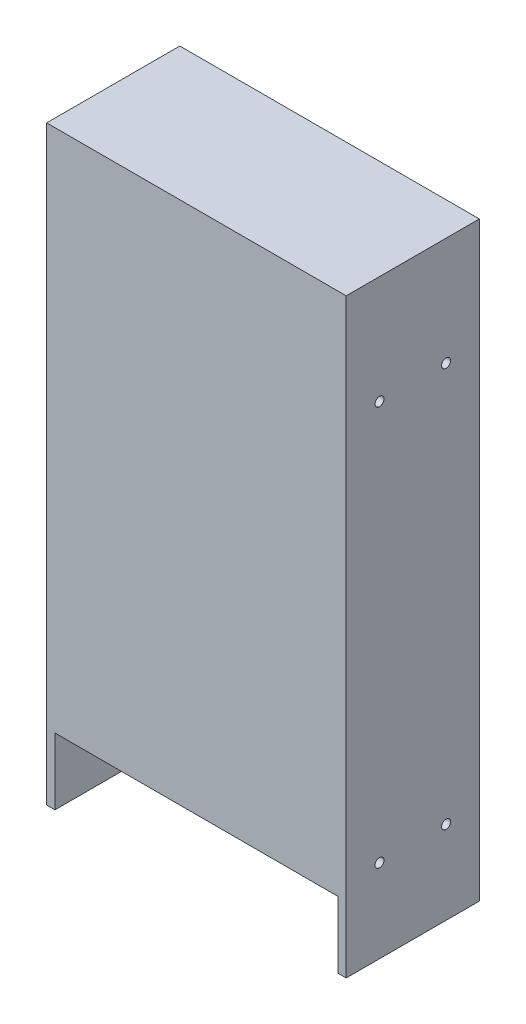
ISO-10303-21;
HEADER;
FILE_DESCRIPTION(('STEP AP214'),'2;1');
FILE_NAME('part.step','',(''),(''),'','','');
FILE_SCHEMA(('AUTOMOTIVE_DESIGN { 1 0 10303 214 1 1 1 1 }'));
ENDSEC;
DATA;
#1=APPLICATION_CONTEXT('core data for automotive mechanical design processes');
#2=APPLICATION_PROTOCOL_DEFINITION('international standard','automotive_design',2000,#1);
#3=PRODUCT_CONTEXT('',#1,'mechanical');
#4=PRODUCT('Part','Part','',(#3));
#5=PRODUCT_RELATED_PRODUCT_CATEGORY('part','',(#4));
#6=PRODUCT_DEFINITION_FORMATION('','',#4);
#7=PRODUCT_DEFINITION_CONTEXT('part definition',#1,'design');
#8=PRODUCT_DEFINITION('design','',#6,#7);
#9=PRODUCT_DEFINITION_SHAPE('','',#8);
#10=(LENGTH_UNIT() NAMED_UNIT(*) SI_UNIT(.MILLI.,.METRE.));
#11=(NAMED_UNIT(*) PLANE_ANGLE_UNIT() SI_UNIT($,.RADIAN.));
#12=(NAMED_UNIT(*) SI_UNIT($,.STERADIAN.) SOLID_ANGLE_UNIT());
#13=UNCERTAINTY_MEASURE_WITH_UNIT(LENGTH_MEASURE(1.E-05),#10,'distance_accuracy_value','');
#14=(GEOMETRIC_REPRESENTATION_CONTEXT(3) GLOBAL_UNCERTAINTY_ASSIGNED_CONTEXT((#13)) GLOBAL_UNIT_ASSIGNED_CONTEXT((#10,
#11,#12)) REPRESENTATION_CONTEXT('',''));
#15=CARTESIAN_POINT('',(0.,0.,0.));
#16=DIRECTION('',(0.,0.,1.));
#17=DIRECTION('',(1.,0.,0.));
#18=AXIS2_PLACEMENT_3D('',#15,#16,#17);
#19=CARTESIAN_POINT('',(-53.6165322580645,41.1725806451613,50.8));
#20=DIRECTION('',(1.,0.,0.));
#21=DIRECTION('',(0.,1.,0.));
#22=AXIS2_PLACEMENT_3D('',#19,#20,#21);
#23=PLANE('',#22);
#24=CARTESIAN_POINT('',(-53.6165322580645,-0.102419354838687,12.7000000000005));
#25=DIRECTION('',(1.,0.,0.));
#26=DIRECTION('',(0.,1.,0.));
#27=AXIS2_PLACEMENT_3D('',#24,#25,#26);
#28=CIRCLE('',#27,1.7145);
#29=CARTESIAN_POINT('',(-53.6165322580645,1.61208064516131,12.7000000000005));
#30=VERTEX_POINT('',#29);
#31=EDGE_CURVE('E198',#30,#30,#28,.F.);
#32=ORIENTED_EDGE('',*,*,#31,.F.);
#33=EDGE_LOOP('',(#32));
#34=FACE_BOUND('',#33,.T.);
#35=CARTESIAN_POINT('',(-53.6165322580645,-0.102419354838853,38.1000000000005));
#36=DIRECTION('',(1.,0.,0.));
#37=DIRECTION('',(0.,1.,0.));
#38=AXIS2_PLACEMENT_3D('',#35,#36,#37);
#39=CIRCLE('',#38,1.7145);
#40=CARTESIAN_POINT('',(-53.6165322580645,1.61208064516114,38.1000000000005));
#41=VERTEX_POINT('',#40);
#42=EDGE_CURVE('E202',#41,#41,#39,.F.);
#43=ORIENTED_EDGE('',*,*,#42,.F.);
#44=EDGE_LOOP('',(#43));
#45=FACE_BOUND('',#44,.T.);
#46=CARTESIAN_POINT('',(-53.6165322580645,-152.502419354839,38.1));
#47=DIRECTION('',(1.,0.,0.));
#48=DIRECTION('',(0.,1.,0.));
#49=AXIS2_PLACEMENT_3D('',#46,#47,#48);
#50=CIRCLE('',#49,1.7145);
#51=CARTESIAN_POINT('',(-53.6165322580645,-150.787919354839,38.1));
#52=VERTEX_POINT('',#51);
#53=EDGE_CURVE('E206',#52,#52,#50,.F.);
#54=ORIENTED_EDGE('',*,*,#53,.F.);
#55=EDGE_LOOP('',(#54));
#56=FACE_BOUND('',#55,.T.);
#57=CARTESIAN_POINT('',(-53.6165322580645,-152.502419354839,12.7));
#58=DIRECTION('',(1.,0.,0.));
#59=DIRECTION('',(0.,1.,0.));
#60=AXIS2_PLACEMENT_3D('',#57,#58,#59);
#61=CIRCLE('',#60,1.7145);
#62=CARTESIAN_POINT('',(-53.6165322580645,-150.787919354839,12.7));
#63=VERTEX_POINT('',#62);
#64=EDGE_CURVE('E138',#63,#63,#61,.F.);
#65=ORIENTED_EDGE('',*,*,#64,.F.);
#66=EDGE_LOOP('',(#65));
#67=FACE_BOUND('',#66,.T.);
#68=DIRECTION('',(0.,-1.,0.));
#69=VECTOR('',#68,1.);
#70=CARTESIAN_POINT('',(-53.6165322580645,41.1725806451613,0.));
#71=LINE('',#70,#69);
#72=CARTESIAN_POINT('',(-53.6165322580645,41.1725806451613,0.));
#73=VERTEX_POINT('',#72);
#74=CARTESIAN_POINT('',(-53.6165322580645,-184.252419354839,0.));
#75=VERTEX_POINT('',#74);
#76=EDGE_CURVE('E144',#73,#75,#71,.T.);
#77=ORIENTED_EDGE('',*,*,#76,.T.);
#78=DIRECTION('',(0.,0.,-1.));
#79=VECTOR('',#78,1.);
#80=CARTESIAN_POINT('',(-53.6165322580645,-184.252419354839,50.8));
#81=LINE('',#80,#79);
#82=CARTESIAN_POINT('',(-53.6165322580645,-184.252419354839,50.8));
#83=VERTEX_POINT('',#82);
#84=EDGE_CURVE('E11',#83,#75,#81,.T.);
#85=ORIENTED_EDGE('',*,*,#84,.F.);
#86=DIRECTION('',(0.,-1.,0.));
#87=VECTOR('',#86,1.);
#88=CARTESIAN_POINT('',(-53.6165322580645,41.1725806451613,50.8));
#89=LINE('',#88,#87);
#90=CARTESIAN_POINT('',(-53.6165322580645,41.1725806451613,50.8));
#91=VERTEX_POINT('',#90);
#92=EDGE_CURVE('E148',#91,#83,#89,.T.);
#93=ORIENTED_EDGE('',*,*,#92,.F.);
#94=DIRECTION('',(0.,0.,-1.));
#95=VECTOR('',#94,1.);
#96=CARTESIAN_POINT('',(-53.6165322580645,41.1725806451613,50.8));
#97=LINE('',#96,#95);
#98=EDGE_CURVE('E155',#91,#73,#97,.T.);
#99=ORIENTED_EDGE('',*,*,#98,.T.);
#100=EDGE_LOOP('',(#77,#85,#93,#99));
#101=FACE_BOUND('',#100,.T.);
#102=ADVANCED_FACE('F36',(#34,#45,#56,#67,#101),#23,.F.);
#103=CARTESIAN_POINT('',(-53.6165322580645,-184.252419354839,50.8));
#104=DIRECTION('',(0.,1.,0.));
#105=DIRECTION('',(0.,0.,1.));
#106=AXIS2_PLACEMENT_3D('',#103,#104,#105);
#107=PLANE('',#106);
#108=DIRECTION('',(1.,0.,0.));
#109=VECTOR('',#108,1.);
#110=CARTESIAN_POINT('',(-50.4415322580645,-184.252419354839,12.7));
#111=LINE('',#110,#109);
#112=CARTESIAN_POINT('',(-50.4415322580645,-184.252419354839,12.7));
#113=VERTEX_POINT('',#112);
#114=CARTESIAN_POINT('',(57.5084677419355,-184.252419354839,12.7));
#115=VERTEX_POINT('',#114);
#116=EDGE_CURVE('E124',#113,#115,#111,.T.);
#117=ORIENTED_EDGE('',*,*,#116,.F.);
#118=DIRECTION('',(0.,0.,1.));
#119=VECTOR('',#118,1.);
#120=CARTESIAN_POINT('',(-50.4415322580645,-184.252419354839,12.7));
#121=LINE('',#120,#119);
#122=CARTESIAN_POINT('',(-50.4415322580645,-184.252419354839,50.8));
#123=VERTEX_POINT('',#122);
#124=EDGE_CURVE('E110',#113,#123,#121,.T.);
#125=ORIENTED_EDGE('',*,*,#124,.T.);
#126=DIRECTION('',(1.,0.,0.));
#127=VECTOR('',#126,1.);
#128=CARTESIAN_POINT('',(-53.6165322580645,-184.252419354839,50.8));
#129=LINE('',#128,#127);
#130=EDGE_CURVE('E87',#83,#123,#129,.T.);
#131=ORIENTED_EDGE('',*,*,#130,.F.);
#132=ORIENTED_EDGE('',*,*,#84,.T.);
#133=DIRECTION('',(1.,0.,0.));
#134=VECTOR('',#133,1.);
#135=CARTESIAN_POINT('',(-53.6165322580645,-184.252419354839,0.));
#136=LINE('',#135,#134);
#137=CARTESIAN_POINT('',(60.6834677419355,-184.252419354839,0.));
#138=VERTEX_POINT('',#137);
#139=EDGE_CURVE('E158',#75,#138,#136,.T.);
#140=ORIENTED_EDGE('',*,*,#139,.T.);
#141=DIRECTION('',(0.,0.,-1.));
#142=VECTOR('',#141,1.);
#143=CARTESIAN_POINT('',(60.6834677419355,-184.252419354839,50.8));
#144=LINE('',#143,#142);
#145=CARTESIAN_POINT('',(60.6834677419355,-184.252419354839,50.8));
#146=VERTEX_POINT('',#145);
#147=EDGE_CURVE('E43',#146,#138,#144,.T.);
#148=ORIENTED_EDGE('',*,*,#147,.F.);
#149=CARTESIAN_POINT('',(57.5084677419355,-184.252419354839,50.8));
#150=VERTEX_POINT('',#149);
#151=EDGE_CURVE('E150',#150,#146,#129,.T.);
#152=ORIENTED_EDGE('',*,*,#151,.F.);
#153=DIRECTION('',(0.,0.,1.));
#154=VECTOR('',#153,1.);
#155=CARTESIAN_POINT('',(57.5084677419355,-184.252419354839,12.7));
#156=LINE('',#155,#154);
#157=EDGE_CURVE('E50',#115,#150,#156,.T.);
#158=ORIENTED_EDGE('',*,*,#157,.F.);
#159=EDGE_LOOP('',(#117,#125,#131,#132,#140,#148,#152,#158));
#160=FACE_BOUND('',#159,.T.);
#161=ADVANCED_FACE('F128',(#160),#107,.F.);
#162=CARTESIAN_POINT('',(60.6834677419355,41.1725806451613,50.8));
#163=DIRECTION('',(-1.,0.,0.));
#164=DIRECTION('',(0.,-1.,0.));
#165=AXIS2_PLACEMENT_3D('',#162,#163,#164);
#166=PLANE('',#165);
#167=CARTESIAN_POINT('',(60.6834677419355,-0.102419354838669,12.7000000000005));
#168=DIRECTION('',(1.,0.,0.));
#169=DIRECTION('',(0.,1.,0.));
#170=AXIS2_PLACEMENT_3D('',#167,#168,#169);
#171=CIRCLE('',#170,1.7145);
#172=CARTESIAN_POINT('',(60.6834677419355,1.61208064516133,12.7000000000005));
#173=VERTEX_POINT('',#172);
#174=EDGE_CURVE('E216',#173,#173,#171,.T.);
#175=ORIENTED_EDGE('',*,*,#174,.F.);
#176=EDGE_LOOP('',(#175));
#177=FACE_BOUND('',#176,.T.);
#178=CARTESIAN_POINT('',(60.6834677419355,-0.102419354838836,38.1000000000005));
#179=DIRECTION('',(1.,0.,0.));
#180=DIRECTION('',(0.,1.,0.));
#181=AXIS2_PLACEMENT_3D('',#178,#179,#180);
#182=CIRCLE('',#181,1.7145);
#183=CARTESIAN_POINT('',(60.6834677419355,1.61208064516116,38.1000000000005));
#184=VERTEX_POINT('',#183);
#185=EDGE_CURVE('E215',#184,#184,#182,.T.);
#186=ORIENTED_EDGE('',*,*,#185,.F.);
#187=EDGE_LOOP('',(#186));
#188=FACE_BOUND('',#187,.T.);
#189=CARTESIAN_POINT('',(60.6834677419355,-152.502419354839,38.1));
#190=DIRECTION('',(1.,0.,0.));
#191=DIRECTION('',(0.,1.,0.));
#192=AXIS2_PLACEMENT_3D('',#189,#190,#191);
#193=CIRCLE('',#192,1.7145);
#194=CARTESIAN_POINT('',(60.6834677419355,-150.787919354839,38.1));
#195=VERTEX_POINT('',#194);
#196=EDGE_CURVE('E220',#195,#195,#193,.T.);
#197=ORIENTED_EDGE('',*,*,#196,.F.);
#198=EDGE_LOOP('',(#197));
#199=FACE_BOUND('',#198,.T.);
#200=CARTESIAN_POINT('',(60.6834677419355,-152.502419354839,12.7));
#201=DIRECTION('',(1.,0.,0.));
#202=DIRECTION('',(0.,1.,0.));
#203=AXIS2_PLACEMENT_3D('',#200,#201,#202);
#204=CIRCLE('',#203,1.7145);
#205=CARTESIAN_POINT('',(60.6834677419355,-150.787919354839,12.7));
#206=VERTEX_POINT('',#205);
#207=EDGE_CURVE('E210',#206,#206,#204,.T.);
#208=ORIENTED_EDGE('',*,*,#207,.F.);
#209=EDGE_LOOP('',(#208));
#210=FACE_BOUND('',#209,.T.);
#211=DIRECTION('',(0.,1.,0.));
#212=VECTOR('',#211,1.);
#213=CARTESIAN_POINT('',(60.6834677419355,41.1725806451613,0.));
#214=LINE('',#213,#212);
#215=CARTESIAN_POINT('',(60.6834677419355,41.1725806451613,0.));
#216=VERTEX_POINT('',#215);
#217=EDGE_CURVE('E160',#138,#216,#214,.T.);
#218=ORIENTED_EDGE('',*,*,#217,.T.);
#219=DIRECTION('',(0.,0.,-1.));
#220=VECTOR('',#219,1.);
#221=CARTESIAN_POINT('',(60.6834677419355,41.1725806451613,50.8));
#222=LINE('',#221,#220);
#223=CARTESIAN_POINT('',(60.6834677419355,41.1725806451613,50.8));
#224=VERTEX_POINT('',#223);
#225=EDGE_CURVE('E164',#224,#216,#222,.T.);
#226=ORIENTED_EDGE('',*,*,#225,.F.);
#227=DIRECTION('',(0.,1.,0.));
#228=VECTOR('',#227,1.);
#229=CARTESIAN_POINT('',(60.6834677419355,41.1725806451613,50.8));
#230=LINE('',#229,#228);
#231=EDGE_CURVE('E152',#146,#224,#230,.T.);
#232=ORIENTED_EDGE('',*,*,#231,.F.);
#233=ORIENTED_EDGE('',*,*,#147,.T.);
#234=EDGE_LOOP('',(#218,#226,#232,#233));
#235=FACE_BOUND('',#234,.T.);
#236=ADVANCED_FACE('F170',(#177,#188,#199,#210,#235),#166,.F.);
#237=CARTESIAN_POINT('',(-53.6165322580645,41.1725806451613,50.8));
#238=DIRECTION('',(0.,-1.,0.));
#239=DIRECTION('',(0.,0.,-1.));
#240=AXIS2_PLACEMENT_3D('',#237,#238,#239);
#241=PLANE('',#240);
#242=DIRECTION('',(-1.,0.,0.));
#243=VECTOR('',#242,1.);
#244=CARTESIAN_POINT('',(-53.6165322580645,41.1725806451613,0.));
#245=LINE('',#244,#243);
#246=EDGE_CURVE('E80',#216,#73,#245,.T.);
#247=ORIENTED_EDGE('',*,*,#246,.T.);
#248=ORIENTED_EDGE('',*,*,#98,.F.);
#249=DIRECTION('',(-1.,0.,0.));
#250=VECTOR('',#249,1.);
#251=CARTESIAN_POINT('',(-53.6165322580645,41.1725806451613,50.8));
#252=LINE('',#251,#250);
#253=EDGE_CURVE('E59',#224,#91,#252,.T.);
#254=ORIENTED_EDGE('',*,*,#253,.F.);
#255=ORIENTED_EDGE('',*,*,#225,.T.);
#256=EDGE_LOOP('',(#247,#248,#254,#255));
#257=FACE_BOUND('',#256,.T.);
#258=ADVANCED_FACE('F178',(#257),#241,.F.);
#259=CARTESIAN_POINT('',(0.,0.,50.8));
#260=DIRECTION('',(0.,0.,1.));
#261=DIRECTION('',(1.,0.,0.));
#262=AXIS2_PLACEMENT_3D('',#259,#260,#261);
#263=PLANE('',#262);
#264=DIRECTION('',(0.,-1.,0.));
#265=VECTOR('',#264,1.);
#266=CARTESIAN_POINT('',(-50.4415322580645,-184.252419354839,50.8));
#267=LINE('',#266,#265);
#268=CARTESIAN_POINT('',(-50.4415322580645,-158.852419354839,50.8));
#269=VERTEX_POINT('',#268);
#270=EDGE_CURVE('E116',#269,#123,#267,.T.);
#271=ORIENTED_EDGE('',*,*,#270,.F.);
#272=DIRECTION('',(-1.,0.,0.));
#273=VECTOR('',#272,1.);
#274=CARTESIAN_POINT('',(-50.4415322580645,-158.852419354839,50.8));
#275=LINE('',#274,#273);
#276=CARTESIAN_POINT('',(57.5084677419355,-158.852419354839,50.8));
#277=VERTEX_POINT('',#276);
#278=EDGE_CURVE('E126',#277,#269,#275,.T.);
#279=ORIENTED_EDGE('',*,*,#278,.F.);
#280=DIRECTION('',(0.,1.,0.));
#281=VECTOR('',#280,1.);
#282=CARTESIAN_POINT('',(57.5084677419355,-184.252419354839,50.8));
#283=LINE('',#282,#281);
#284=EDGE_CURVE('E137',#150,#277,#283,.T.);
#285=ORIENTED_EDGE('',*,*,#284,.F.);
#286=ORIENTED_EDGE('',*,*,#151,.T.);
#287=ORIENTED_EDGE('',*,*,#231,.T.);
#288=ORIENTED_EDGE('',*,*,#253,.T.);
#289=ORIENTED_EDGE('',*,*,#92,.T.);
#290=ORIENTED_EDGE('',*,*,#130,.T.);
#291=EDGE_LOOP('',(#271,#279,#285,#286,#287,#288,#289,#290));
#292=FACE_BOUND('',#291,.T.);
#293=ADVANCED_FACE('F180',(#292),#263,.T.);
#294=CARTESIAN_POINT('',(0.,0.,0.));
#295=DIRECTION('',(0.,0.,1.));
#296=DIRECTION('',(1.,0.,0.));
#297=AXIS2_PLACEMENT_3D('',#294,#295,#296);
#298=PLANE('',#297);
#299=ORIENTED_EDGE('',*,*,#76,.F.);
#300=ORIENTED_EDGE('',*,*,#246,.F.);
#301=ORIENTED_EDGE('',*,*,#217,.F.);
#302=ORIENTED_EDGE('',*,*,#139,.F.);
#303=EDGE_LOOP('',(#299,#300,#301,#302));
#304=FACE_BOUND('',#303,.T.);
#305=ADVANCED_FACE('F174',(#304),#298,.F.);
#306=CARTESIAN_POINT('',(-50.4415322580645,-184.252419354839,12.7));
#307=DIRECTION('',(-1.,0.,0.));
#308=DIRECTION('',(0.,0.,1.));
#309=AXIS2_PLACEMENT_3D('',#306,#307,#308);
#310=PLANE('',#309);
#311=ORIENTED_EDGE('',*,*,#270,.T.);
#312=ORIENTED_EDGE('',*,*,#124,.F.);
#313=DIRECTION('',(0.,-1.,0.));
#314=VECTOR('',#313,1.);
#315=CARTESIAN_POINT('',(-50.4415322580645,-184.252419354839,12.7));
#316=LINE('',#315,#314);
#317=CARTESIAN_POINT('',(-50.4415322580645,-158.852419354839,12.7));
#318=VERTEX_POINT('',#317);
#319=EDGE_CURVE('E113',#318,#113,#316,.T.);
#320=ORIENTED_EDGE('',*,*,#319,.F.);
#321=DIRECTION('',(0.,0.,1.));
#322=VECTOR('',#321,1.);
#323=CARTESIAN_POINT('',(-50.4415322580645,-158.852419354839,12.7));
#324=LINE('',#323,#322);
#325=EDGE_CURVE('E142',#318,#269,#324,.T.);
#326=ORIENTED_EDGE('',*,*,#325,.T.);
#327=EDGE_LOOP('',(#311,#312,#320,#326));
#328=FACE_BOUND('',#327,.T.);
#329=ADVANCED_FACE('F112',(#328),#310,.F.);
#330=CARTESIAN_POINT('',(-50.4415322580645,-158.852419354839,12.7));
#331=DIRECTION('',(0.,1.,0.));
#332=DIRECTION('',(0.,0.,1.));
#333=AXIS2_PLACEMENT_3D('',#330,#331,#332);
#334=PLANE('',#333);
#335=ORIENTED_EDGE('',*,*,#278,.T.);
#336=ORIENTED_EDGE('',*,*,#325,.F.);
#337=DIRECTION('',(-1.,0.,0.));
#338=VECTOR('',#337,1.);
#339=CARTESIAN_POINT('',(-50.4415322580645,-158.852419354839,12.7));
#340=LINE('',#339,#338);
#341=CARTESIAN_POINT('',(57.5084677419355,-158.852419354839,12.7));
#342=VERTEX_POINT('',#341);
#343=EDGE_CURVE('E118',#342,#318,#340,.T.);
#344=ORIENTED_EDGE('',*,*,#343,.F.);
#345=DIRECTION('',(0.,0.,1.));
#346=VECTOR('',#345,1.);
#347=CARTESIAN_POINT('',(57.5084677419355,-158.852419354839,12.7));
#348=LINE('',#347,#346);
#349=EDGE_CURVE('E145',#342,#277,#348,.T.);
#350=ORIENTED_EDGE('',*,*,#349,.T.);
#351=EDGE_LOOP('',(#335,#336,#344,#350));
#352=FACE_BOUND('',#351,.T.);
#353=ADVANCED_FACE('F248',(#352),#334,.F.);
#354=CARTESIAN_POINT('',(57.5084677419355,-184.252419354839,12.7));
#355=DIRECTION('',(1.,0.,0.));
#356=DIRECTION('',(0.,0.,-1.));
#357=AXIS2_PLACEMENT_3D('',#354,#355,#356);
#358=PLANE('',#357);
#359=ORIENTED_EDGE('',*,*,#284,.T.);
#360=ORIENTED_EDGE('',*,*,#349,.F.);
#361=DIRECTION('',(0.,1.,0.));
#362=VECTOR('',#361,1.);
#363=CARTESIAN_POINT('',(57.5084677419355,-184.252419354839,12.7));
#364=LINE('',#363,#362);
#365=EDGE_CURVE('E130',#115,#342,#364,.T.);
#366=ORIENTED_EDGE('',*,*,#365,.F.);
#367=ORIENTED_EDGE('',*,*,#157,.T.);
#368=EDGE_LOOP('',(#359,#360,#366,#367));
#369=FACE_BOUND('',#368,.T.);
#370=ADVANCED_FACE('F242',(#369),#358,.F.);
#371=CARTESIAN_POINT('',(0.,0.,12.7));
#372=DIRECTION('',(0.,0.,-1.));
#373=DIRECTION('',(-1.,0.,0.));
#374=AXIS2_PLACEMENT_3D('',#371,#372,#373);
#375=PLANE('',#374);
#376=ORIENTED_EDGE('',*,*,#319,.T.);
#377=ORIENTED_EDGE('',*,*,#116,.T.);
#378=ORIENTED_EDGE('',*,*,#365,.T.);
#379=ORIENTED_EDGE('',*,*,#343,.T.);
#380=EDGE_LOOP('',(#376,#377,#378,#379));
#381=FACE_BOUND('',#380,.T.);
#382=ADVANCED_FACE('F122',(#381),#375,.F.);
#383=CARTESIAN_POINT('',(-58.4658705634418,-152.502419354839,12.7));
#384=DIRECTION('',(1.,0.,0.));
#385=DIRECTION('',(0.,1.,0.));
#386=AXIS2_PLACEMENT_3D('',#383,#384,#385);
#387=CYLINDRICAL_SURFACE('',#386,1.7145);
#388=ORIENTED_EDGE('',*,*,#64,.T.);
#389=EDGE_LOOP('',(#388));
#390=FACE_BOUND('',#389,.T.);
#391=ORIENTED_EDGE('',*,*,#207,.T.);
#392=EDGE_LOOP('',(#391));
#393=FACE_BOUND('',#392,.T.);
#394=ADVANCED_FACE('F232',(#390,#393),#387,.F.);
#395=CARTESIAN_POINT('',(-58.4658705634418,-152.502419354839,38.1));
#396=DIRECTION('',(1.,0.,0.));
#397=DIRECTION('',(0.,1.,0.));
#398=AXIS2_PLACEMENT_3D('',#395,#396,#397);
#399=CYLINDRICAL_SURFACE('',#398,1.7145);
#400=ORIENTED_EDGE('',*,*,#53,.T.);
#401=EDGE_LOOP('',(#400));
#402=FACE_BOUND('',#401,.T.);
#403=ORIENTED_EDGE('',*,*,#196,.T.);
#404=EDGE_LOOP('',(#403));
#405=FACE_BOUND('',#404,.T.);
#406=ADVANCED_FACE('F227',(#402,#405),#399,.F.);
#407=CARTESIAN_POINT('',(-58.4658705634419,-0.102419354838854,38.1000000000005));
#408=DIRECTION('',(1.,0.,0.));
#409=DIRECTION('',(0.,1.,0.));
#410=AXIS2_PLACEMENT_3D('',#407,#408,#409);
#411=CYLINDRICAL_SURFACE('',#410,1.7145);
#412=ORIENTED_EDGE('',*,*,#42,.T.);
#413=EDGE_LOOP('',(#412));
#414=FACE_BOUND('',#413,.T.);
#415=ORIENTED_EDGE('',*,*,#185,.T.);
#416=EDGE_LOOP('',(#415));
#417=FACE_BOUND('',#416,.T.);
#418=ADVANCED_FACE('F239',(#414,#417),#411,.F.);
#419=CARTESIAN_POINT('',(-58.4658705634419,-0.102419354838688,12.7000000000005));
#420=DIRECTION('',(1.,0.,0.));
#421=DIRECTION('',(0.,1.,0.));
#422=AXIS2_PLACEMENT_3D('',#419,#420,#421);
#423=CYLINDRICAL_SURFACE('',#422,1.7145);
#424=ORIENTED_EDGE('',*,*,#31,.T.);
#425=EDGE_LOOP('',(#424));
#426=FACE_BOUND('',#425,.T.);
#427=ORIENTED_EDGE('',*,*,#174,.T.);
#428=EDGE_LOOP('',(#427));
#429=FACE_BOUND('',#428,.T.);
#430=ADVANCED_FACE('F245',(#426,#429),#423,.F.);
#431=CLOSED_SHELL('',(#102,#161,#236,#258,#293,#305,#329,#353,#370,#382,#394,#406,#418,#430));
#432=MANIFOLD_SOLID_BREP('B2',#431);
#433=ADVANCED_BREP_SHAPE_REPRESENTATION('',(#18,#432),#14);
#434=SHAPE_DEFINITION_REPRESENTATION(#9,#433);
ENDSEC;
END-ISO-10303-21;
